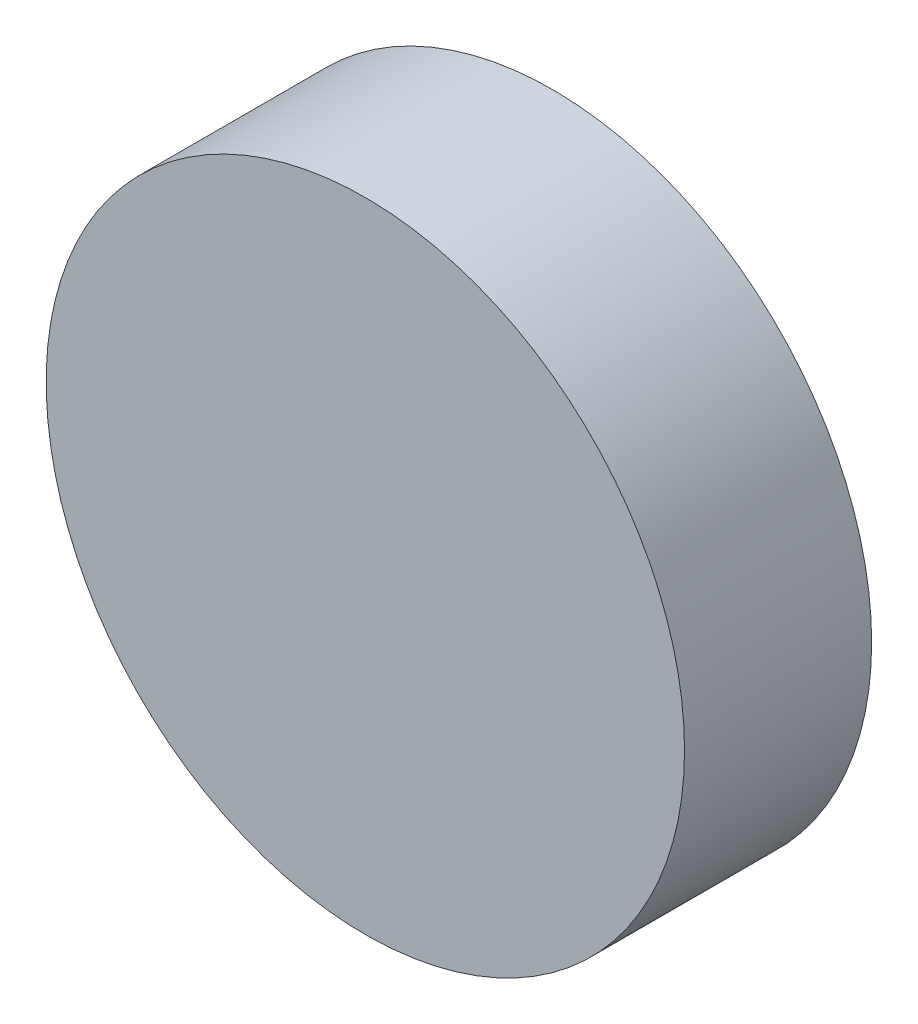
ISO-10303-21;
HEADER;
FILE_DESCRIPTION(('STEP AP214'),'2;1');
FILE_NAME('part.step','',(''),(''),'','','');
FILE_SCHEMA(('AUTOMOTIVE_DESIGN { 1 0 10303 214 1 1 1 1 }'));
ENDSEC;
DATA;
#1=APPLICATION_CONTEXT('core data for automotive mechanical design processes');
#2=APPLICATION_PROTOCOL_DEFINITION('international standard','automotive_design',2000,#1);
#3=PRODUCT_CONTEXT('',#1,'mechanical');
#4=PRODUCT('Part','Part','',(#3));
#5=PRODUCT_RELATED_PRODUCT_CATEGORY('part','',(#4));
#6=PRODUCT_DEFINITION_FORMATION('','',#4);
#7=PRODUCT_DEFINITION_CONTEXT('part definition',#1,'design');
#8=PRODUCT_DEFINITION('design','',#6,#7);
#9=PRODUCT_DEFINITION_SHAPE('','',#8);
#10=(LENGTH_UNIT() NAMED_UNIT(*) SI_UNIT(.MILLI.,.METRE.));
#11=(NAMED_UNIT(*) PLANE_ANGLE_UNIT() SI_UNIT($,.RADIAN.));
#12=(NAMED_UNIT(*) SI_UNIT($,.STERADIAN.) SOLID_ANGLE_UNIT());
#13=UNCERTAINTY_MEASURE_WITH_UNIT(LENGTH_MEASURE(1.E-05),#10,'distance_accuracy_value','');
#14=(GEOMETRIC_REPRESENTATION_CONTEXT(3) GLOBAL_UNCERTAINTY_ASSIGNED_CONTEXT((#13)) GLOBAL_UNIT_ASSIGNED_CONTEXT((#10,
#11,#12)) REPRESENTATION_CONTEXT('',''));
#15=CARTESIAN_POINT('',(0.,0.,0.));
#16=DIRECTION('',(0.,0.,1.));
#17=DIRECTION('',(1.,0.,0.));
#18=AXIS2_PLACEMENT_3D('',#15,#16,#17);
#19=CARTESIAN_POINT('',(0.,0.,21.59));
#20=DIRECTION('',(0.,0.,-1.));
#21=DIRECTION('',(-1.,0.,0.));
#22=AXIS2_PLACEMENT_3D('',#19,#20,#21);
#23=CYLINDRICAL_SURFACE('',#22,36.83);
#24=CARTESIAN_POINT('',(0.,0.,21.59));
#25=DIRECTION('',(0.,0.,1.));
#26=DIRECTION('',(1.,0.,0.));
#27=AXIS2_PLACEMENT_3D('',#24,#25,#26);
#28=CIRCLE('',#27,36.83);
#29=CARTESIAN_POINT('',(36.83,0.,21.59));
#30=VERTEX_POINT('',#29);
#31=EDGE_CURVE('E10',#30,#30,#28,.T.);
#32=ORIENTED_EDGE('',*,*,#31,.F.);
#33=EDGE_LOOP('',(#32));
#34=FACE_BOUND('',#33,.T.);
#35=CARTESIAN_POINT('',(0.,0.,0.));
#36=DIRECTION('',(0.,0.,1.));
#37=DIRECTION('',(1.,0.,0.));
#38=AXIS2_PLACEMENT_3D('',#35,#36,#37);
#39=CIRCLE('',#38,36.83);
#40=CARTESIAN_POINT('',(36.83,0.,0.));
#41=VERTEX_POINT('',#40);
#42=EDGE_CURVE('E41',#41,#41,#39,.T.);
#43=ORIENTED_EDGE('',*,*,#42,.T.);
#44=EDGE_LOOP('',(#43));
#45=FACE_BOUND('',#44,.T.);
#46=ADVANCED_FACE('F38',(#34,#45),#23,.T.);
#47=CARTESIAN_POINT('',(0.,0.,21.59));
#48=DIRECTION('',(0.,0.,1.));
#49=DIRECTION('',(1.,0.,0.));
#50=AXIS2_PLACEMENT_3D('',#47,#48,#49);
#51=PLANE('',#50);
#52=ORIENTED_EDGE('',*,*,#31,.T.);
#53=EDGE_LOOP('',(#52));
#54=FACE_BOUND('',#53,.T.);
#55=ADVANCED_FACE('F53',(#54),#51,.T.);
#56=CARTESIAN_POINT('',(0.,0.,0.));
#57=DIRECTION('',(0.,0.,1.));
#58=DIRECTION('',(1.,0.,0.));
#59=AXIS2_PLACEMENT_3D('',#56,#57,#58);
#60=PLANE('',#59);
#61=ORIENTED_EDGE('',*,*,#42,.F.);
#62=EDGE_LOOP('',(#61));
#63=FACE_BOUND('',#62,.T.);
#64=ADVANCED_FACE('F51',(#63),#60,.F.);
#65=CLOSED_SHELL('',(#46,#55,#64));
#66=MANIFOLD_SOLID_BREP('B2',#65);
#67=ADVANCED_BREP_SHAPE_REPRESENTATION('',(#18,#66),#14);
#68=SHAPE_DEFINITION_REPRESENTATION(#9,#67);
ENDSEC;
END-ISO-10303-21;
